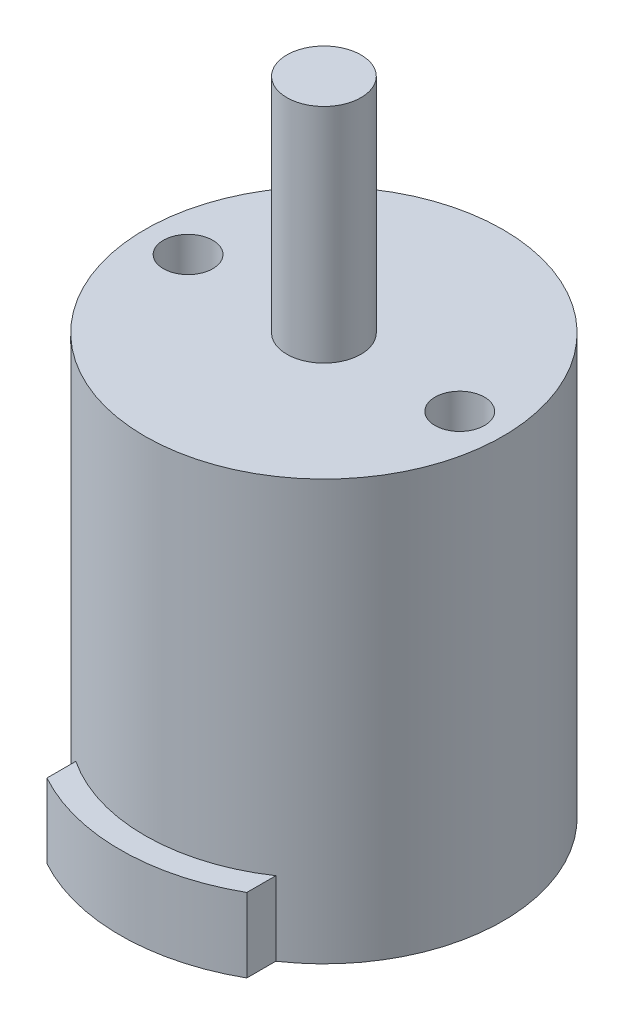
ISO-10303-21;
HEADER;
FILE_DESCRIPTION(('STEP AP214'),'2;1');
FILE_NAME('part.step','',(''),(''),'','','');
FILE_SCHEMA(('AUTOMOTIVE_DESIGN { 1 0 10303 214 1 1 1 1 }'));
ENDSEC;
DATA;
#1=APPLICATION_CONTEXT('core data for automotive mechanical design processes');
#2=APPLICATION_PROTOCOL_DEFINITION('international standard','automotive_design',2000,#1);
#3=PRODUCT_CONTEXT('',#1,'mechanical');
#4=PRODUCT('Part','Part','',(#3));
#5=PRODUCT_RELATED_PRODUCT_CATEGORY('part','',(#4));
#6=PRODUCT_DEFINITION_FORMATION('','',#4);
#7=PRODUCT_DEFINITION_CONTEXT('part definition',#1,'design');
#8=PRODUCT_DEFINITION('design','',#6,#7);
#9=PRODUCT_DEFINITION_SHAPE('','',#8);
#10=(LENGTH_UNIT() NAMED_UNIT(*) SI_UNIT(.MILLI.,.METRE.));
#11=(NAMED_UNIT(*) PLANE_ANGLE_UNIT() SI_UNIT($,.RADIAN.));
#12=(NAMED_UNIT(*) SI_UNIT($,.STERADIAN.) SOLID_ANGLE_UNIT());
#13=UNCERTAINTY_MEASURE_WITH_UNIT(LENGTH_MEASURE(1.E-05),#10,'distance_accuracy_value','');
#14=(GEOMETRIC_REPRESENTATION_CONTEXT(3) GLOBAL_UNCERTAINTY_ASSIGNED_CONTEXT((#13)) GLOBAL_UNIT_ASSIGNED_CONTEXT((#10,
#11,#12)) REPRESENTATION_CONTEXT('',''));
#15=CARTESIAN_POINT('',(0.,0.,0.));
#16=DIRECTION('',(0.,0.,1.));
#17=DIRECTION('',(1.,0.,0.));
#18=AXIS2_PLACEMENT_3D('',#15,#16,#17);
#19=CARTESIAN_POINT('',(0.,17.,0.));
#20=DIRECTION('',(0.,-1.,0.));
#21=DIRECTION('',(0.,0.,-1.));
#22=AXIS2_PLACEMENT_3D('',#19,#20,#21);
#23=CYLINDRICAL_SURFACE('',#22,7.25);
#24=CARTESIAN_POINT('',(0.,0.,0.));
#25=DIRECTION('',(0.,1.,0.));
#26=DIRECTION('',(0.,0.,1.));
#27=AXIS2_PLACEMENT_3D('',#24,#25,#26);
#28=CIRCLE('',#27,7.25);
#29=CARTESIAN_POINT('',(4.05967436111618,0.,6.00679149643934));
#30=VERTEX_POINT('',#29);
#31=CARTESIAN_POINT('',(-4.,0.,6.04669331122391));
#32=VERTEX_POINT('',#31);
#33=EDGE_CURVE('E114',#30,#32,#28,.T.);
#34=ORIENTED_EDGE('',*,*,#33,.T.);
#35=DIRECTION('',(0.,-1.,0.));
#36=VECTOR('',#35,1.);
#37=CARTESIAN_POINT('',(-4.,17.,6.04669331122391));
#38=LINE('',#37,#36);
#39=CARTESIAN_POINT('',(-4.,3.,6.04669331122391));
#40=VERTEX_POINT('',#39);
#41=EDGE_CURVE('E50',#32,#40,#38,.F.);
#42=ORIENTED_EDGE('',*,*,#41,.T.);
#43=CARTESIAN_POINT('',(0.,3.,0.));
#44=DIRECTION('',(0.,-1.,0.));
#45=DIRECTION('',(0.,0.,-1.));
#46=AXIS2_PLACEMENT_3D('',#43,#44,#45);
#47=CIRCLE('',#46,7.25);
#48=CARTESIAN_POINT('',(4.05967436111618,3.,6.00679149643934));
#49=VERTEX_POINT('',#48);
#50=EDGE_CURVE('E11',#49,#40,#47,.T.);
#51=ORIENTED_EDGE('',*,*,#50,.F.);
#52=DIRECTION('',(0.,-1.,0.));
#53=VECTOR('',#52,1.);
#54=CARTESIAN_POINT('',(4.05967436111618,3.,6.00679149643934));
#55=LINE('',#54,#53);
#56=EDGE_CURVE('E85',#49,#30,#55,.T.);
#57=ORIENTED_EDGE('',*,*,#56,.T.);
#58=EDGE_LOOP('',(#34,#42,#51,#57));
#59=FACE_BOUND('',#58,.T.);
#60=CARTESIAN_POINT('',(0.,17.,0.));
#61=DIRECTION('',(0.,1.,0.));
#62=DIRECTION('',(0.,0.,1.));
#63=AXIS2_PLACEMENT_3D('',#60,#61,#62);
#64=CIRCLE('',#63,7.25);
#65=CARTESIAN_POINT('',(0.,17.,7.25));
#66=VERTEX_POINT('',#65);
#67=EDGE_CURVE('E117',#66,#66,#64,.T.);
#68=ORIENTED_EDGE('',*,*,#67,.F.);
#69=EDGE_LOOP('',(#68));
#70=FACE_BOUND('',#69,.T.);
#71=ADVANCED_FACE('F36',(#59,#70),#23,.T.);
#72=CARTESIAN_POINT('',(0.,17.,0.));
#73=DIRECTION('',(0.,1.,0.));
#74=DIRECTION('',(0.,0.,1.));
#75=AXIS2_PLACEMENT_3D('',#72,#73,#74);
#76=PLANE('',#75);
#77=CARTESIAN_POINT('',(5.5,17.,0.));
#78=DIRECTION('',(0.,1.,0.));
#79=DIRECTION('',(0.,0.,1.));
#80=AXIS2_PLACEMENT_3D('',#77,#78,#79);
#81=CIRCLE('',#80,1.);
#82=CARTESIAN_POINT('',(5.5,17.,1.));
#83=VERTEX_POINT('',#82);
#84=EDGE_CURVE('E250',#83,#83,#81,.T.);
#85=ORIENTED_EDGE('',*,*,#84,.F.);
#86=EDGE_LOOP('',(#85));
#87=FACE_BOUND('',#86,.T.);
#88=CARTESIAN_POINT('',(-5.5,17.,0.));
#89=DIRECTION('',(0.,1.,0.));
#90=DIRECTION('',(0.,0.,1.));
#91=AXIS2_PLACEMENT_3D('',#88,#89,#90);
#92=CIRCLE('',#91,1.);
#93=CARTESIAN_POINT('',(-5.5,17.,1.));
#94=VERTEX_POINT('',#93);
#95=EDGE_CURVE('E100',#94,#94,#92,.T.);
#96=ORIENTED_EDGE('',*,*,#95,.F.);
#97=EDGE_LOOP('',(#96));
#98=FACE_BOUND('',#97,.T.);
#99=CARTESIAN_POINT('',(0.,17.,0.));
#100=DIRECTION('',(0.,1.,0.));
#101=DIRECTION('',(0.,0.,1.));
#102=AXIS2_PLACEMENT_3D('',#99,#100,#101);
#103=CIRCLE('',#102,1.5);
#104=CARTESIAN_POINT('',(0.,17.,1.5));
#105=VERTEX_POINT('',#104);
#106=EDGE_CURVE('E43',#105,#105,#103,.T.);
#107=ORIENTED_EDGE('',*,*,#106,.F.);
#108=EDGE_LOOP('',(#107));
#109=FACE_BOUND('',#108,.T.);
#110=ORIENTED_EDGE('',*,*,#67,.T.);
#111=EDGE_LOOP('',(#110));
#112=FACE_BOUND('',#111,.T.);
#113=ADVANCED_FACE('F127',(#87,#98,#109,#112),#76,.T.);
#114=CARTESIAN_POINT('',(0.,0.,0.));
#115=DIRECTION('',(0.,1.,0.));
#116=DIRECTION('',(0.,0.,1.));
#117=AXIS2_PLACEMENT_3D('',#114,#115,#116);
#118=PLANE('',#117);
#119=ORIENTED_EDGE('',*,*,#33,.F.);
#120=DIRECTION('',(0.,0.,1.));
#121=VECTOR('',#120,1.);
#122=CARTESIAN_POINT('',(4.05967436111618,0.,6.00679149643934));
#123=LINE('',#122,#121);
#124=CARTESIAN_POINT('',(4.05967436111618,0.,7.18202924539408));
#125=VERTEX_POINT('',#124);
#126=EDGE_CURVE('E104',#30,#125,#123,.T.);
#127=ORIENTED_EDGE('',*,*,#126,.T.);
#128=CARTESIAN_POINT('',(0.,0.,0.));
#129=DIRECTION('',(0.,-1.,0.));
#130=DIRECTION('',(0.,0.,-1.));
#131=AXIS2_PLACEMENT_3D('',#128,#129,#130);
#132=CIRCLE('',#131,8.25);
#133=CARTESIAN_POINT('',(-4.,0.,7.21543484483091));
#134=VERTEX_POINT('',#133);
#135=EDGE_CURVE('E79',#125,#134,#132,.T.);
#136=ORIENTED_EDGE('',*,*,#135,.T.);
#137=DIRECTION('',(0.,0.,-1.));
#138=VECTOR('',#137,1.);
#139=CARTESIAN_POINT('',(-4.,0.,7.21543484483091));
#140=LINE('',#139,#138);
#141=EDGE_CURVE('E95',#134,#32,#140,.T.);
#142=ORIENTED_EDGE('',*,*,#141,.T.);
#143=EDGE_LOOP('',(#119,#127,#136,#142));
#144=FACE_BOUND('',#143,.T.);
#145=ADVANCED_FACE('F124',(#144),#118,.F.);
#146=CARTESIAN_POINT('',(0.,26.,0.));
#147=DIRECTION('',(0.,-1.,0.));
#148=DIRECTION('',(0.,0.,-1.));
#149=AXIS2_PLACEMENT_3D('',#146,#147,#148);
#150=CYLINDRICAL_SURFACE('',#149,1.5);
#151=CARTESIAN_POINT('',(0.,26.,0.));
#152=DIRECTION('',(0.,1.,0.));
#153=DIRECTION('',(0.,0.,1.));
#154=AXIS2_PLACEMENT_3D('',#151,#152,#153);
#155=CIRCLE('',#154,1.5);
#156=CARTESIAN_POINT('',(0.,26.,1.5));
#157=VERTEX_POINT('',#156);
#158=EDGE_CURVE('E111',#157,#157,#155,.T.);
#159=ORIENTED_EDGE('',*,*,#158,.F.);
#160=EDGE_LOOP('',(#159));
#161=FACE_BOUND('',#160,.T.);
#162=ORIENTED_EDGE('',*,*,#106,.T.);
#163=EDGE_LOOP('',(#162));
#164=FACE_BOUND('',#163,.T.);
#165=ADVANCED_FACE('F126',(#161,#164),#150,.T.);
#166=CARTESIAN_POINT('',(0.,26.,0.));
#167=DIRECTION('',(0.,1.,0.));
#168=DIRECTION('',(0.,0.,1.));
#169=AXIS2_PLACEMENT_3D('',#166,#167,#168);
#170=PLANE('',#169);
#171=ORIENTED_EDGE('',*,*,#158,.T.);
#172=EDGE_LOOP('',(#171));
#173=FACE_BOUND('',#172,.T.);
#174=ADVANCED_FACE('F132',(#173),#170,.T.);
#175=CARTESIAN_POINT('',(-4.,3.,7.21543484483091));
#176=DIRECTION('',(-1.,0.,0.));
#177=DIRECTION('',(0.,0.,1.));
#178=AXIS2_PLACEMENT_3D('',#175,#176,#177);
#179=PLANE('',#178);
#180=ORIENTED_EDGE('',*,*,#41,.F.);
#181=ORIENTED_EDGE('',*,*,#141,.F.);
#182=DIRECTION('',(0.,-1.,0.));
#183=VECTOR('',#182,1.);
#184=CARTESIAN_POINT('',(-4.,3.,7.21543484483091));
#185=LINE('',#184,#183);
#186=CARTESIAN_POINT('',(-4.,3.,7.21543484483091));
#187=VERTEX_POINT('',#186);
#188=EDGE_CURVE('E84',#187,#134,#185,.T.);
#189=ORIENTED_EDGE('',*,*,#188,.F.);
#190=DIRECTION('',(0.,0.,-1.));
#191=VECTOR('',#190,1.);
#192=CARTESIAN_POINT('',(-4.,3.,7.21543484483091));
#193=LINE('',#192,#191);
#194=EDGE_CURVE('E92',#187,#40,#193,.T.);
#195=ORIENTED_EDGE('',*,*,#194,.T.);
#196=EDGE_LOOP('',(#180,#181,#189,#195));
#197=FACE_BOUND('',#196,.T.);
#198=ADVANCED_FACE('F123',(#197),#179,.T.);
#199=CARTESIAN_POINT('',(0.,3.,0.));
#200=DIRECTION('',(0.,-1.,0.));
#201=DIRECTION('',(0.,0.,-1.));
#202=AXIS2_PLACEMENT_3D('',#199,#200,#201);
#203=CYLINDRICAL_SURFACE('',#202,8.25);
#204=ORIENTED_EDGE('',*,*,#135,.F.);
#205=DIRECTION('',(0.,-1.,0.));
#206=VECTOR('',#205,1.);
#207=CARTESIAN_POINT('',(4.05967436111618,3.,7.18202924539408));
#208=LINE('',#207,#206);
#209=CARTESIAN_POINT('',(4.05967436111618,3.,7.18202924539408));
#210=VERTEX_POINT('',#209);
#211=EDGE_CURVE('E73',#210,#125,#208,.T.);
#212=ORIENTED_EDGE('',*,*,#211,.F.);
#213=CARTESIAN_POINT('',(0.,3.,0.));
#214=DIRECTION('',(0.,-1.,0.));
#215=DIRECTION('',(0.,0.,-1.));
#216=AXIS2_PLACEMENT_3D('',#213,#214,#215);
#217=CIRCLE('',#216,8.25);
#218=EDGE_CURVE('E76',#210,#187,#217,.T.);
#219=ORIENTED_EDGE('',*,*,#218,.T.);
#220=ORIENTED_EDGE('',*,*,#188,.T.);
#221=EDGE_LOOP('',(#204,#212,#219,#220));
#222=FACE_BOUND('',#221,.T.);
#223=ADVANCED_FACE('F75',(#222),#203,.T.);
#224=CARTESIAN_POINT('',(4.05967436111618,3.,6.00679149643934));
#225=DIRECTION('',(1.,0.,0.));
#226=DIRECTION('',(0.,0.,-1.));
#227=AXIS2_PLACEMENT_3D('',#224,#225,#226);
#228=PLANE('',#227);
#229=ORIENTED_EDGE('',*,*,#126,.F.);
#230=ORIENTED_EDGE('',*,*,#56,.F.);
#231=DIRECTION('',(0.,0.,1.));
#232=VECTOR('',#231,1.);
#233=CARTESIAN_POINT('',(4.05967436111618,3.,6.00679149643934));
#234=LINE('',#233,#232);
#235=EDGE_CURVE('E90',#49,#210,#234,.T.);
#236=ORIENTED_EDGE('',*,*,#235,.T.);
#237=ORIENTED_EDGE('',*,*,#211,.T.);
#238=EDGE_LOOP('',(#229,#230,#236,#237));
#239=FACE_BOUND('',#238,.T.);
#240=ADVANCED_FACE('F94',(#239),#228,.T.);
#241=CARTESIAN_POINT('',(0.,3.,0.));
#242=DIRECTION('',(0.,-1.,0.));
#243=DIRECTION('',(0.,0.,-1.));
#244=AXIS2_PLACEMENT_3D('',#241,#242,#243);
#245=PLANE('',#244);
#246=ORIENTED_EDGE('',*,*,#235,.F.);
#247=ORIENTED_EDGE('',*,*,#50,.T.);
#248=ORIENTED_EDGE('',*,*,#194,.F.);
#249=ORIENTED_EDGE('',*,*,#218,.F.);
#250=EDGE_LOOP('',(#246,#247,#248,#249));
#251=FACE_BOUND('',#250,.T.);
#252=ADVANCED_FACE('F89',(#251),#245,.F.);
#253=CARTESIAN_POINT('',(-5.5,14.,0.));
#254=DIRECTION('',(0.,1.,0.));
#255=DIRECTION('',(0.,0.,1.));
#256=AXIS2_PLACEMENT_3D('',#253,#254,#255);
#257=CYLINDRICAL_SURFACE('',#256,1.);
#258=CARTESIAN_POINT('',(-5.5,14.,0.));
#259=DIRECTION('',(0.,1.,0.));
#260=DIRECTION('',(0.,0.,1.));
#261=AXIS2_PLACEMENT_3D('',#258,#259,#260);
#262=CIRCLE('',#261,1.);
#263=CARTESIAN_POINT('',(-5.5,14.,1.));
#264=VERTEX_POINT('',#263);
#265=EDGE_CURVE('E253',#264,#264,#262,.T.);
#266=ORIENTED_EDGE('',*,*,#265,.F.);
#267=EDGE_LOOP('',(#266));
#268=FACE_BOUND('',#267,.T.);
#269=ORIENTED_EDGE('',*,*,#95,.T.);
#270=EDGE_LOOP('',(#269));
#271=FACE_BOUND('',#270,.T.);
#272=ADVANCED_FACE('F156',(#268,#271),#257,.F.);
#273=CARTESIAN_POINT('',(-5.5,14.,0.));
#274=DIRECTION('',(0.,1.,0.));
#275=DIRECTION('',(0.,0.,1.));
#276=AXIS2_PLACEMENT_3D('',#273,#274,#275);
#277=PLANE('',#276);
#278=ORIENTED_EDGE('',*,*,#265,.T.);
#279=EDGE_LOOP('',(#278));
#280=FACE_BOUND('',#279,.T.);
#281=ADVANCED_FACE('F161',(#280),#277,.T.);
#282=CARTESIAN_POINT('',(5.5,14.,0.));
#283=DIRECTION('',(0.,1.,0.));
#284=DIRECTION('',(0.,0.,1.));
#285=AXIS2_PLACEMENT_3D('',#282,#283,#284);
#286=CYLINDRICAL_SURFACE('',#285,1.);
#287=CARTESIAN_POINT('',(5.5,14.,0.));
#288=DIRECTION('',(0.,1.,0.));
#289=DIRECTION('',(0.,0.,1.));
#290=AXIS2_PLACEMENT_3D('',#287,#288,#289);
#291=CIRCLE('',#290,1.);
#292=CARTESIAN_POINT('',(5.5,14.,1.));
#293=VERTEX_POINT('',#292);
#294=EDGE_CURVE('E106',#293,#293,#291,.T.);
#295=ORIENTED_EDGE('',*,*,#294,.F.);
#296=EDGE_LOOP('',(#295));
#297=FACE_BOUND('',#296,.T.);
#298=ORIENTED_EDGE('',*,*,#84,.T.);
#299=EDGE_LOOP('',(#298));
#300=FACE_BOUND('',#299,.T.);
#301=ADVANCED_FACE('F171',(#297,#300),#286,.F.);
#302=CARTESIAN_POINT('',(5.5,14.,0.));
#303=DIRECTION('',(0.,1.,0.));
#304=DIRECTION('',(0.,0.,1.));
#305=AXIS2_PLACEMENT_3D('',#302,#303,#304);
#306=PLANE('',#305);
#307=ORIENTED_EDGE('',*,*,#294,.T.);
#308=EDGE_LOOP('',(#307));
#309=FACE_BOUND('',#308,.T.);
#310=ADVANCED_FACE('F181',(#309),#306,.T.);
#311=CLOSED_SHELL('',(#71,#113,#145,#165,#174,#198,#223,#240,#252,#272,#281,#301,#310));
#312=MANIFOLD_SOLID_BREP('B2',#311);
#313=ADVANCED_BREP_SHAPE_REPRESENTATION('',(#18,#312),#14);
#314=SHAPE_DEFINITION_REPRESENTATION(#9,#313);
ENDSEC;
END-ISO-10303-21;
